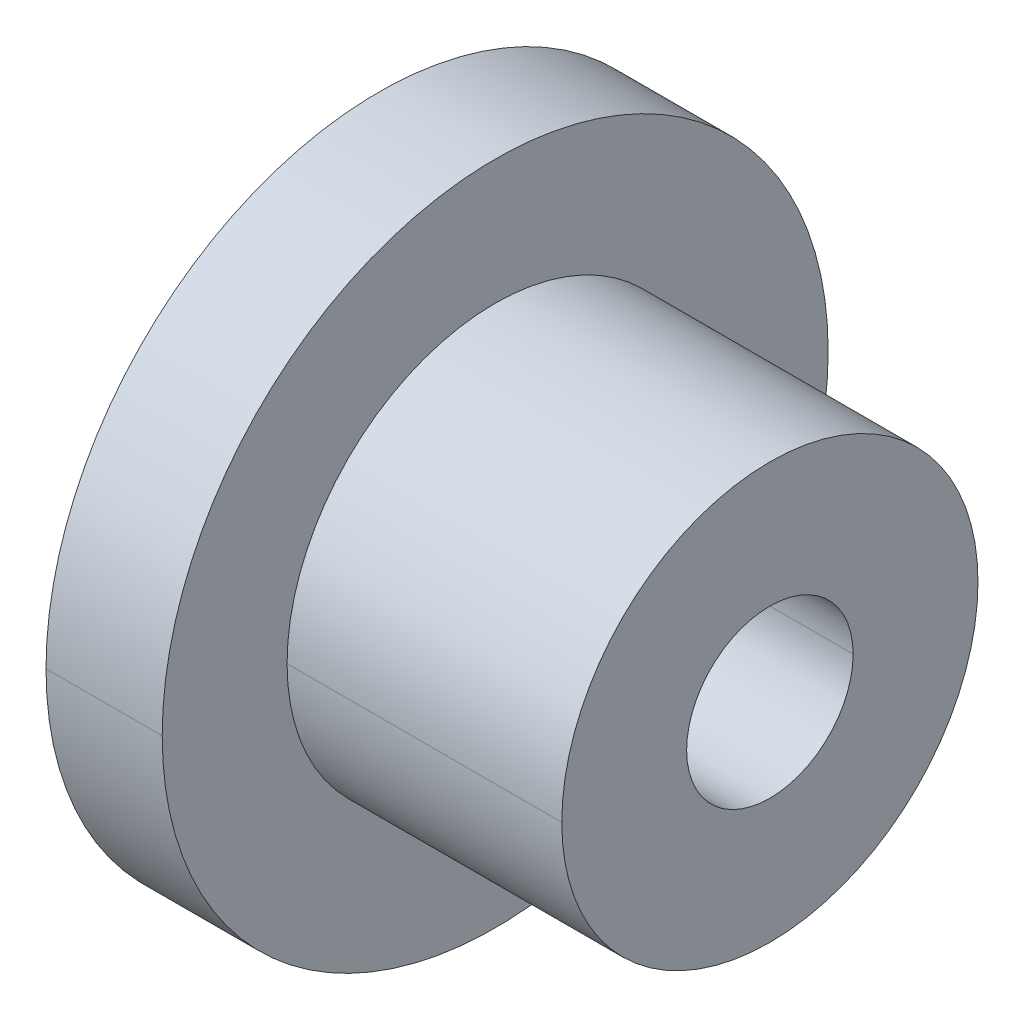
ISO-10303-21;
HEADER;
FILE_DESCRIPTION(('STEP AP214'),'2;1');
FILE_NAME('part.step','',(''),(''),'','','');
FILE_SCHEMA(('AUTOMOTIVE_DESIGN { 1 0 10303 214 1 1 1 1 }'));
ENDSEC;
DATA;
#1=APPLICATION_CONTEXT('core data for automotive mechanical design processes');
#2=APPLICATION_PROTOCOL_DEFINITION('international standard','automotive_design',2000,#1);
#3=PRODUCT_CONTEXT('',#1,'mechanical');
#4=PRODUCT('Part','Part','',(#3));
#5=PRODUCT_RELATED_PRODUCT_CATEGORY('part','',(#4));
#6=PRODUCT_DEFINITION_FORMATION('','',#4);
#7=PRODUCT_DEFINITION_CONTEXT('part definition',#1,'design');
#8=PRODUCT_DEFINITION('design','',#6,#7);
#9=PRODUCT_DEFINITION_SHAPE('','',#8);
#10=(LENGTH_UNIT() NAMED_UNIT(*) SI_UNIT(.MILLI.,.METRE.));
#11=(NAMED_UNIT(*) PLANE_ANGLE_UNIT() SI_UNIT($,.RADIAN.));
#12=(NAMED_UNIT(*) SI_UNIT($,.STERADIAN.) SOLID_ANGLE_UNIT());
#13=UNCERTAINTY_MEASURE_WITH_UNIT(LENGTH_MEASURE(1.E-05),#10,'distance_accuracy_value','');
#14=(GEOMETRIC_REPRESENTATION_CONTEXT(3) GLOBAL_UNCERTAINTY_ASSIGNED_CONTEXT((#13)) GLOBAL_UNIT_ASSIGNED_CONTEXT((#10,
#11,#12)) REPRESENTATION_CONTEXT('',''));
#15=CARTESIAN_POINT('',(0.,0.,0.));
#16=DIRECTION('',(0.,0.,1.));
#17=DIRECTION('',(1.,0.,0.));
#18=AXIS2_PLACEMENT_3D('',#15,#16,#17);
#19=CARTESIAN_POINT('',(-15.2227901080182,0.,0.));
#20=DIRECTION('',(-1.,0.,0.));
#21=DIRECTION('',(0.,0.,1.));
#22=AXIS2_PLACEMENT_3D('',#19,#20,#21);
#23=CYLINDRICAL_SURFACE('',#22,25.);
#24=DIRECTION('',(-1.,0.,0.));
#25=VECTOR('',#24,1.);
#26=CARTESIAN_POINT('',(-15.2227901080182,0.,-25.));
#27=LINE('',#26,#25);
#28=CARTESIAN_POINT('',(25.6069971260244,0.,-25.));
#29=VERTEX_POINT('',#28);
#30=CARTESIAN_POINT('',(-7.39300287397559,0.,-25.));
#31=VERTEX_POINT('',#30);
#32=EDGE_CURVE('E20',#29,#31,#27,.T.);
#33=ORIENTED_EDGE('',*,*,#32,.F.);
#34=CARTESIAN_POINT('',(25.6069971260244,0.,0.));
#35=DIRECTION('',(-1.,0.,0.));
#36=DIRECTION('',(0.,0.,1.));
#37=AXIS2_PLACEMENT_3D('',#34,#35,#36);
#38=CIRCLE('',#37,25.);
#39=CARTESIAN_POINT('',(25.6069971260244,0.,25.));
#40=VERTEX_POINT('',#39);
#41=EDGE_CURVE('E88',#29,#40,#38,.T.);
#42=ORIENTED_EDGE('',*,*,#41,.T.);
#43=DIRECTION('',(-1.,0.,0.));
#44=VECTOR('',#43,1.);
#45=CARTESIAN_POINT('',(-15.2227901080182,0.,25.));
#46=LINE('',#45,#44);
#47=CARTESIAN_POINT('',(-7.39300287397559,0.,25.));
#48=VERTEX_POINT('',#47);
#49=EDGE_CURVE('E103',#40,#48,#46,.T.);
#50=ORIENTED_EDGE('',*,*,#49,.T.);
#51=CARTESIAN_POINT('',(-7.39300287397559,0.,0.));
#52=DIRECTION('',(-1.,0.,0.));
#53=DIRECTION('',(0.,0.,1.));
#54=AXIS2_PLACEMENT_3D('',#51,#52,#53);
#55=CIRCLE('',#54,25.);
#56=EDGE_CURVE('E10',#31,#48,#55,.T.);
#57=ORIENTED_EDGE('',*,*,#56,.F.);
#58=EDGE_LOOP('',(#33,#42,#50,#57));
#59=FACE_BOUND('',#58,.T.);
#60=ADVANCED_FACE('F16',(#59),#23,.T.);
#61=CARTESIAN_POINT('',(-7.39300287397559,40.,0.));
#62=DIRECTION('',(-1.,0.,0.));
#63=DIRECTION('',(0.,0.,1.));
#64=AXIS2_PLACEMENT_3D('',#61,#62,#63);
#65=PLANE('',#64);
#66=CARTESIAN_POINT('',(-7.39300287397559,0.,0.));
#67=DIRECTION('',(-1.,0.,0.));
#68=DIRECTION('',(0.,0.,1.));
#69=AXIS2_PLACEMENT_3D('',#66,#67,#68);
#70=CIRCLE('',#69,25.);
#71=EDGE_CURVE('E101',#48,#31,#70,.T.);
#72=ORIENTED_EDGE('',*,*,#71,.T.);
#73=ORIENTED_EDGE('',*,*,#56,.T.);
#74=EDGE_LOOP('',(#72,#73));
#75=FACE_BOUND('',#74,.T.);
#76=CARTESIAN_POINT('',(-7.39300287397559,0.,0.));
#77=DIRECTION('',(-1.,0.,0.));
#78=DIRECTION('',(0.,0.,1.));
#79=AXIS2_PLACEMENT_3D('',#76,#77,#78);
#80=CIRCLE('',#79,40.);
#81=CARTESIAN_POINT('',(-7.39300287397559,0.,40.));
#82=VERTEX_POINT('',#81);
#83=CARTESIAN_POINT('',(-7.39300287397559,0.,-40.));
#84=VERTEX_POINT('',#83);
#85=EDGE_CURVE('E144',#82,#84,#80,.T.);
#86=ORIENTED_EDGE('',*,*,#85,.F.);
#87=CARTESIAN_POINT('',(-7.39300287397559,0.,0.));
#88=DIRECTION('',(-1.,0.,0.));
#89=DIRECTION('',(0.,0.,1.));
#90=AXIS2_PLACEMENT_3D('',#87,#88,#89);
#91=CIRCLE('',#90,40.);
#92=EDGE_CURVE('E27',#84,#82,#91,.T.);
#93=ORIENTED_EDGE('',*,*,#92,.F.);
#94=EDGE_LOOP('',(#86,#93));
#95=FACE_BOUND('',#94,.T.);
#96=ADVANCED_FACE('F269',(#75,#95),#65,.F.);
#97=CARTESIAN_POINT('',(-15.2227901080182,0.,0.));
#98=DIRECTION('',(-1.,0.,0.));
#99=DIRECTION('',(0.,0.,1.));
#100=AXIS2_PLACEMENT_3D('',#97,#98,#99);
#101=CYLINDRICAL_SURFACE('',#100,40.);
#102=DIRECTION('',(-1.,0.,0.));
#103=VECTOR('',#102,1.);
#104=CARTESIAN_POINT('',(-15.2227901080182,0.,-40.));
#105=LINE('',#104,#103);
#106=CARTESIAN_POINT('',(-21.3504496824863,0.,-40.));
#107=VERTEX_POINT('',#106);
#108=EDGE_CURVE('E112',#84,#107,#105,.T.);
#109=ORIENTED_EDGE('',*,*,#108,.F.);
#110=ORIENTED_EDGE('',*,*,#92,.T.);
#111=DIRECTION('',(-1.,0.,0.));
#112=VECTOR('',#111,1.);
#113=CARTESIAN_POINT('',(-15.2227901080182,0.,40.));
#114=LINE('',#113,#112);
#115=CARTESIAN_POINT('',(-21.3504496824863,0.,40.));
#116=VERTEX_POINT('',#115);
#117=EDGE_CURVE('E116',#82,#116,#114,.T.);
#118=ORIENTED_EDGE('',*,*,#117,.T.);
#119=CARTESIAN_POINT('',(-21.3504496824863,0.,0.));
#120=DIRECTION('',(-1.,0.,0.));
#121=DIRECTION('',(0.,0.,1.));
#122=AXIS2_PLACEMENT_3D('',#119,#120,#121);
#123=CIRCLE('',#122,40.);
#124=EDGE_CURVE('E148',#107,#116,#123,.T.);
#125=ORIENTED_EDGE('',*,*,#124,.F.);
#126=EDGE_LOOP('',(#109,#110,#118,#125));
#127=FACE_BOUND('',#126,.T.);
#128=ADVANCED_FACE('F162',(#127),#101,.T.);
#129=CARTESIAN_POINT('',(-21.3504496824863,10.,0.));
#130=DIRECTION('',(1.,0.,0.));
#131=DIRECTION('',(0.,1.,0.));
#132=AXIS2_PLACEMENT_3D('',#129,#130,#131);
#133=PLANE('',#132);
#134=CARTESIAN_POINT('',(-21.3504496824863,0.,0.));
#135=DIRECTION('',(-1.,0.,0.));
#136=DIRECTION('',(0.,0.,1.));
#137=AXIS2_PLACEMENT_3D('',#134,#135,#136);
#138=CIRCLE('',#137,10.);
#139=CARTESIAN_POINT('',(-21.3504496824863,0.,10.));
#140=VERTEX_POINT('',#139);
#141=CARTESIAN_POINT('',(-21.3504496824863,0.,-10.));
#142=VERTEX_POINT('',#141);
#143=EDGE_CURVE('E41',#140,#142,#138,.T.);
#144=ORIENTED_EDGE('',*,*,#143,.F.);
#145=CARTESIAN_POINT('',(-21.3504496824863,0.,0.));
#146=DIRECTION('',(-1.,0.,0.));
#147=DIRECTION('',(0.,0.,1.));
#148=AXIS2_PLACEMENT_3D('',#145,#146,#147);
#149=CIRCLE('',#148,10.);
#150=EDGE_CURVE('E118',#142,#140,#149,.T.);
#151=ORIENTED_EDGE('',*,*,#150,.F.);
#152=EDGE_LOOP('',(#144,#151));
#153=FACE_BOUND('',#152,.T.);
#154=CARTESIAN_POINT('',(-21.3504496824863,0.,0.));
#155=DIRECTION('',(-1.,0.,0.));
#156=DIRECTION('',(0.,0.,1.));
#157=AXIS2_PLACEMENT_3D('',#154,#155,#156);
#158=CIRCLE('',#157,40.);
#159=EDGE_CURVE('E114',#116,#107,#158,.T.);
#160=ORIENTED_EDGE('',*,*,#159,.T.);
#161=ORIENTED_EDGE('',*,*,#124,.T.);
#162=EDGE_LOOP('',(#160,#161));
#163=FACE_BOUND('',#162,.T.);
#164=ADVANCED_FACE('F169',(#153,#163),#133,.F.);
#165=CARTESIAN_POINT('',(-15.2227901080182,0.,0.));
#166=DIRECTION('',(-1.,0.,0.));
#167=DIRECTION('',(0.,0.,1.));
#168=AXIS2_PLACEMENT_3D('',#165,#166,#167);
#169=CYLINDRICAL_SURFACE('',#168,10.);
#170=DIRECTION('',(-1.,0.,0.));
#171=VECTOR('',#170,1.);
#172=CARTESIAN_POINT('',(-15.2227901080182,0.,-10.));
#173=LINE('',#172,#171);
#174=CARTESIAN_POINT('',(25.6069971260244,0.,-10.));
#175=VERTEX_POINT('',#174);
#176=EDGE_CURVE('E126',#175,#142,#173,.T.);
#177=ORIENTED_EDGE('',*,*,#176,.F.);
#178=CARTESIAN_POINT('',(25.6069971260244,0.,0.));
#179=DIRECTION('',(-1.,0.,0.));
#180=DIRECTION('',(0.,0.,1.));
#181=AXIS2_PLACEMENT_3D('',#178,#179,#180);
#182=CIRCLE('',#181,10.);
#183=CARTESIAN_POINT('',(25.6069971260244,0.,10.));
#184=VERTEX_POINT('',#183);
#185=EDGE_CURVE('E94',#184,#175,#182,.T.);
#186=ORIENTED_EDGE('',*,*,#185,.F.);
#187=DIRECTION('',(-1.,0.,0.));
#188=VECTOR('',#187,1.);
#189=CARTESIAN_POINT('',(-15.2227901080182,0.,10.));
#190=LINE('',#189,#188);
#191=EDGE_CURVE('E95',#184,#140,#190,.T.);
#192=ORIENTED_EDGE('',*,*,#191,.T.);
#193=ORIENTED_EDGE('',*,*,#143,.T.);
#194=EDGE_LOOP('',(#177,#186,#192,#193));
#195=FACE_BOUND('',#194,.T.);
#196=ADVANCED_FACE('F18',(#195),#169,.F.);
#197=CARTESIAN_POINT('',(25.6069971260244,25.,0.));
#198=DIRECTION('',(-1.,0.,0.));
#199=DIRECTION('',(0.,0.,1.));
#200=AXIS2_PLACEMENT_3D('',#197,#198,#199);
#201=PLANE('',#200);
#202=ORIENTED_EDGE('',*,*,#185,.T.);
#203=CARTESIAN_POINT('',(25.6069971260244,0.,0.));
#204=DIRECTION('',(-1.,0.,0.));
#205=DIRECTION('',(0.,0.,1.));
#206=AXIS2_PLACEMENT_3D('',#203,#204,#205);
#207=CIRCLE('',#206,10.);
#208=EDGE_CURVE('E135',#175,#184,#207,.T.);
#209=ORIENTED_EDGE('',*,*,#208,.T.);
#210=EDGE_LOOP('',(#202,#209));
#211=FACE_BOUND('',#210,.T.);
#212=CARTESIAN_POINT('',(25.6069971260244,0.,0.));
#213=DIRECTION('',(-1.,0.,0.));
#214=DIRECTION('',(0.,0.,1.));
#215=AXIS2_PLACEMENT_3D('',#212,#213,#214);
#216=CIRCLE('',#215,25.);
#217=EDGE_CURVE('E91',#40,#29,#216,.T.);
#218=ORIENTED_EDGE('',*,*,#217,.F.);
#219=ORIENTED_EDGE('',*,*,#41,.F.);
#220=EDGE_LOOP('',(#218,#219));
#221=FACE_BOUND('',#220,.T.);
#222=ADVANCED_FACE('F89',(#211,#221),#201,.F.);
#223=CARTESIAN_POINT('',(-15.2227901080182,0.,0.));
#224=DIRECTION('',(-1.,0.,0.));
#225=DIRECTION('',(0.,0.,1.));
#226=AXIS2_PLACEMENT_3D('',#223,#224,#225);
#227=CYLINDRICAL_SURFACE('',#226,10.);
#228=ORIENTED_EDGE('',*,*,#208,.F.);
#229=ORIENTED_EDGE('',*,*,#176,.T.);
#230=ORIENTED_EDGE('',*,*,#150,.T.);
#231=ORIENTED_EDGE('',*,*,#191,.F.);
#232=EDGE_LOOP('',(#228,#229,#230,#231));
#233=FACE_BOUND('',#232,.T.);
#234=ADVANCED_FACE('F260',(#233),#227,.F.);
#235=CARTESIAN_POINT('',(-15.2227901080182,0.,0.));
#236=DIRECTION('',(-1.,0.,0.));
#237=DIRECTION('',(0.,0.,1.));
#238=AXIS2_PLACEMENT_3D('',#235,#236,#237);
#239=CYLINDRICAL_SURFACE('',#238,40.);
#240=ORIENTED_EDGE('',*,*,#85,.T.);
#241=ORIENTED_EDGE('',*,*,#108,.T.);
#242=ORIENTED_EDGE('',*,*,#159,.F.);
#243=ORIENTED_EDGE('',*,*,#117,.F.);
#244=EDGE_LOOP('',(#240,#241,#242,#243));
#245=FACE_BOUND('',#244,.T.);
#246=ADVANCED_FACE('F167',(#245),#239,.T.);
#247=CARTESIAN_POINT('',(-15.2227901080182,0.,0.));
#248=DIRECTION('',(-1.,0.,0.));
#249=DIRECTION('',(0.,0.,1.));
#250=AXIS2_PLACEMENT_3D('',#247,#248,#249);
#251=CYLINDRICAL_SURFACE('',#250,25.);
#252=ORIENTED_EDGE('',*,*,#217,.T.);
#253=ORIENTED_EDGE('',*,*,#32,.T.);
#254=ORIENTED_EDGE('',*,*,#71,.F.);
#255=ORIENTED_EDGE('',*,*,#49,.F.);
#256=EDGE_LOOP('',(#252,#253,#254,#255));
#257=FACE_BOUND('',#256,.T.);
#258=ADVANCED_FACE('F102',(#257),#251,.T.);
#259=CLOSED_SHELL('',(#60,#96,#128,#164,#196,#222,#234,#246,#258));
#260=MANIFOLD_SOLID_BREP('B1',#259);
#261=ADVANCED_BREP_SHAPE_REPRESENTATION('',(#18,#260),#14);
#262=SHAPE_DEFINITION_REPRESENTATION(#9,#261);
ENDSEC;
END-ISO-10303-21;
